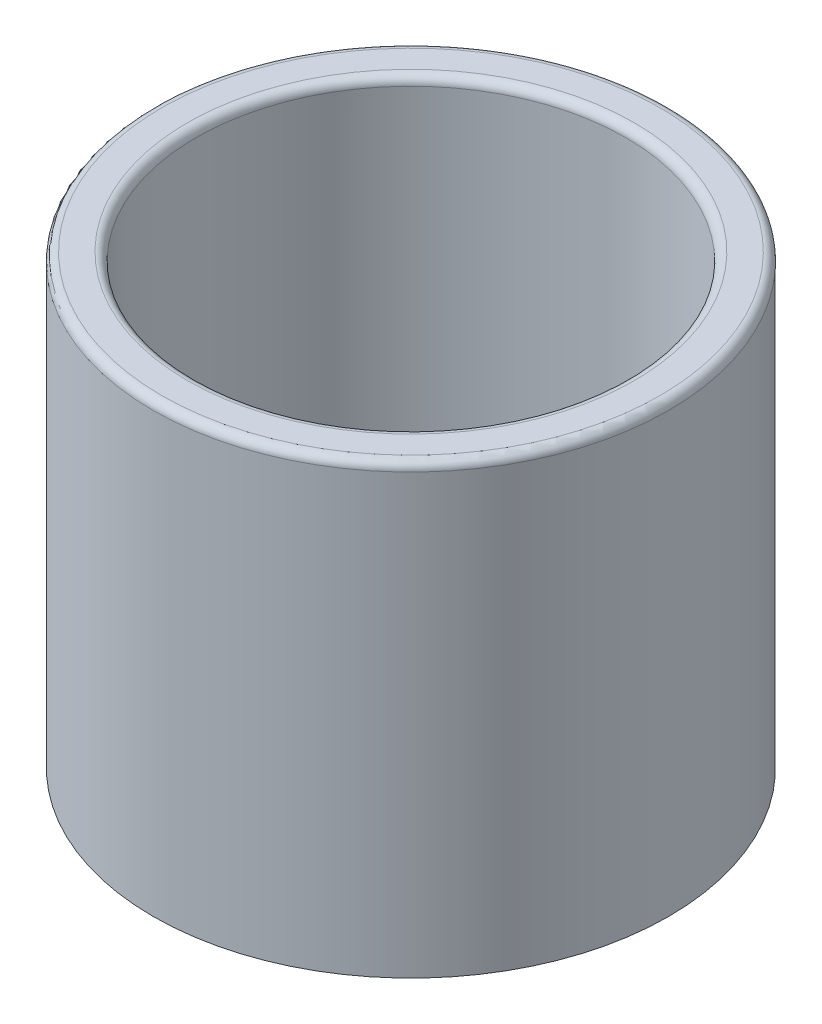
ISO-10303-21;
HEADER;
FILE_DESCRIPTION(('STEP AP214'),'2;1');
FILE_NAME('part.step','',(''),(''),'','','');
FILE_SCHEMA(('AUTOMOTIVE_DESIGN { 1 0 10303 214 1 1 1 1 }'));
ENDSEC;
DATA;
#1=APPLICATION_CONTEXT('core data for automotive mechanical design processes');
#2=APPLICATION_PROTOCOL_DEFINITION('international standard','automotive_design',2000,#1);
#3=PRODUCT_CONTEXT('',#1,'mechanical');
#4=PRODUCT('Part','Part','',(#3));
#5=PRODUCT_RELATED_PRODUCT_CATEGORY('part','',(#4));
#6=PRODUCT_DEFINITION_FORMATION('','',#4);
#7=PRODUCT_DEFINITION_CONTEXT('part definition',#1,'design');
#8=PRODUCT_DEFINITION('design','',#6,#7);
#9=PRODUCT_DEFINITION_SHAPE('','',#8);
#10=(LENGTH_UNIT() NAMED_UNIT(*) SI_UNIT(.MILLI.,.METRE.));
#11=(NAMED_UNIT(*) PLANE_ANGLE_UNIT() SI_UNIT($,.RADIAN.));
#12=(NAMED_UNIT(*) SI_UNIT($,.STERADIAN.) SOLID_ANGLE_UNIT());
#13=UNCERTAINTY_MEASURE_WITH_UNIT(LENGTH_MEASURE(1.E-05),#10,'distance_accuracy_value','');
#14=(GEOMETRIC_REPRESENTATION_CONTEXT(3) GLOBAL_UNCERTAINTY_ASSIGNED_CONTEXT((#13)) GLOBAL_UNIT_ASSIGNED_CONTEXT((#10,
#11,#12)) REPRESENTATION_CONTEXT('',''));
#15=CARTESIAN_POINT('',(0.,0.,0.));
#16=DIRECTION('',(0.,0.,1.));
#17=DIRECTION('',(1.,0.,0.));
#18=AXIS2_PLACEMENT_3D('',#15,#16,#17);
#19=CARTESIAN_POINT('',(0.,50.,0.));
#20=DIRECTION('',(0.,1.,0.));
#21=DIRECTION('',(0.,0.,1.));
#22=AXIS2_PLACEMENT_3D('',#19,#20,#21);
#23=PLANE('',#22);
#24=CARTESIAN_POINT('',(0.,50.,0.));
#25=DIRECTION('',(0.,1.,0.));
#26=DIRECTION('',(0.,0.,1.));
#27=AXIS2_PLACEMENT_3D('',#24,#25,#26);
#28=CIRCLE('',#27,26.);
#29=CARTESIAN_POINT('',(0.,50.,26.));
#30=VERTEX_POINT('',#29);
#31=EDGE_CURVE('E37',#30,#30,#28,.F.);
#32=ORIENTED_EDGE('',*,*,#31,.T.);
#33=EDGE_LOOP('',(#32));
#34=FACE_BOUND('',#33,.T.);
#35=CARTESIAN_POINT('',(0.,50.,0.));
#36=DIRECTION('',(0.,1.,0.));
#37=DIRECTION('',(0.,0.,1.));
#38=AXIS2_PLACEMENT_3D('',#35,#36,#37);
#39=CIRCLE('',#38,29.);
#40=CARTESIAN_POINT('',(0.,50.,29.));
#41=VERTEX_POINT('',#40);
#42=EDGE_CURVE('E41',#41,#41,#39,.T.);
#43=ORIENTED_EDGE('',*,*,#42,.T.);
#44=EDGE_LOOP('',(#43));
#45=FACE_BOUND('',#44,.T.);
#46=ADVANCED_FACE('F30',(#34,#45),#23,.T.);
#47=CARTESIAN_POINT('',(0.,50.,0.));
#48=DIRECTION('',(0.,-1.,0.));
#49=DIRECTION('',(0.,0.,-1.));
#50=AXIS2_PLACEMENT_3D('',#47,#48,#49);
#51=CYLINDRICAL_SURFACE('',#50,30.);
#52=CARTESIAN_POINT('',(0.,49.,0.));
#53=DIRECTION('',(0.,1.,0.));
#54=DIRECTION('',(0.,0.,1.));
#55=AXIS2_PLACEMENT_3D('',#52,#53,#54);
#56=CIRCLE('',#55,30.);
#57=CARTESIAN_POINT('',(0.,49.,30.));
#58=VERTEX_POINT('',#57);
#59=EDGE_CURVE('E10',#58,#58,#56,.F.);
#60=ORIENTED_EDGE('',*,*,#59,.T.);
#61=EDGE_LOOP('',(#60));
#62=FACE_BOUND('',#61,.T.);
#63=CARTESIAN_POINT('',(0.,-2.,0.));
#64=DIRECTION('',(0.,-1.,0.));
#65=DIRECTION('',(0.,0.,-1.));
#66=AXIS2_PLACEMENT_3D('',#63,#64,#65);
#67=CIRCLE('',#66,30.);
#68=CARTESIAN_POINT('',(0.,-2.,-30.));
#69=VERTEX_POINT('',#68);
#70=EDGE_CURVE('E56',#69,#69,#67,.T.);
#71=ORIENTED_EDGE('',*,*,#70,.F.);
#72=EDGE_LOOP('',(#71));
#73=FACE_BOUND('',#72,.T.);
#74=ADVANCED_FACE('F62',(#62,#73),#51,.T.);
#75=CARTESIAN_POINT('',(0.,50.,0.));
#76=DIRECTION('',(0.,-1.,0.));
#77=DIRECTION('',(0.,0.,-1.));
#78=AXIS2_PLACEMENT_3D('',#75,#76,#77);
#79=CYLINDRICAL_SURFACE('',#78,25.);
#80=CARTESIAN_POINT('',(0.,1.,0.));
#81=DIRECTION('',(0.,-1.,0.));
#82=DIRECTION('',(0.,0.,-1.));
#83=AXIS2_PLACEMENT_3D('',#80,#81,#82);
#84=CIRCLE('',#83,25.);
#85=CARTESIAN_POINT('',(0.,1.,-25.));
#86=VERTEX_POINT('',#85);
#87=EDGE_CURVE('E45',#86,#86,#84,.T.);
#88=ORIENTED_EDGE('',*,*,#87,.T.);
#89=EDGE_LOOP('',(#88));
#90=FACE_BOUND('',#89,.T.);
#91=CARTESIAN_POINT('',(0.,49.,0.));
#92=DIRECTION('',(0.,1.,0.));
#93=DIRECTION('',(0.,0.,1.));
#94=AXIS2_PLACEMENT_3D('',#91,#92,#93);
#95=CIRCLE('',#94,25.);
#96=CARTESIAN_POINT('',(0.,49.,25.));
#97=VERTEX_POINT('',#96);
#98=EDGE_CURVE('E50',#97,#97,#95,.T.);
#99=ORIENTED_EDGE('',*,*,#98,.T.);
#100=EDGE_LOOP('',(#99));
#101=FACE_BOUND('',#100,.T.);
#102=ADVANCED_FACE('F64',(#90,#101),#79,.F.);
#103=CARTESIAN_POINT('',(0.,0.,0.));
#104=DIRECTION('',(0.,-1.,0.));
#105=DIRECTION('',(0.,0.,-1.));
#106=AXIS2_PLACEMENT_3D('',#103,#104,#105);
#107=PLANE('',#106);
#108=CARTESIAN_POINT('',(0.,0.,0.));
#109=DIRECTION('',(0.,-1.,0.));
#110=DIRECTION('',(0.,0.,-1.));
#111=AXIS2_PLACEMENT_3D('',#108,#109,#110);
#112=CIRCLE('',#111,24.);
#113=CARTESIAN_POINT('',(0.,0.,-24.));
#114=VERTEX_POINT('',#113);
#115=EDGE_CURVE('E53',#114,#114,#112,.F.);
#116=ORIENTED_EDGE('',*,*,#115,.T.);
#117=EDGE_LOOP('',(#116));
#118=FACE_BOUND('',#117,.T.);
#119=ADVANCED_FACE('F70',(#118),#107,.F.);
#120=CARTESIAN_POINT('',(0.,-2.,0.));
#121=DIRECTION('',(0.,-1.,0.));
#122=DIRECTION('',(0.,0.,-1.));
#123=AXIS2_PLACEMENT_3D('',#120,#121,#122);
#124=PLANE('',#123);
#125=ORIENTED_EDGE('',*,*,#70,.T.);
#126=EDGE_LOOP('',(#125));
#127=FACE_BOUND('',#126,.T.);
#128=ADVANCED_FACE('F60',(#127),#124,.T.);
#129=CARTESIAN_POINT('',(0.,1.,0.));
#130=DIRECTION('',(0.,-1.,0.));
#131=DIRECTION('',(0.,0.,-1.));
#132=AXIS2_PLACEMENT_3D('',#129,#130,#131);
#133=TOROIDAL_SURFACE('',#132,24.,1.);
#134=ORIENTED_EDGE('',*,*,#87,.F.);
#135=EDGE_LOOP('',(#134));
#136=FACE_BOUND('',#135,.T.);
#137=ORIENTED_EDGE('',*,*,#115,.F.);
#138=EDGE_LOOP('',(#137));
#139=FACE_BOUND('',#138,.T.);
#140=ADVANCED_FACE('F75',(#136,#139),#133,.F.);
#141=CARTESIAN_POINT('',(0.,49.,0.));
#142=DIRECTION('',(0.,1.,0.));
#143=DIRECTION('',(0.,0.,1.));
#144=AXIS2_PLACEMENT_3D('',#141,#142,#143);
#145=TOROIDAL_SURFACE('',#144,26.,1.);
#146=ORIENTED_EDGE('',*,*,#31,.F.);
#147=EDGE_LOOP('',(#146));
#148=FACE_BOUND('',#147,.T.);
#149=ORIENTED_EDGE('',*,*,#98,.F.);
#150=EDGE_LOOP('',(#149));
#151=FACE_BOUND('',#150,.T.);
#152=ADVANCED_FACE('F77',(#148,#151),#145,.T.);
#153=CARTESIAN_POINT('',(0.,49.,0.));
#154=DIRECTION('',(0.,1.,0.));
#155=DIRECTION('',(0.,0.,1.));
#156=AXIS2_PLACEMENT_3D('',#153,#154,#155);
#157=TOROIDAL_SURFACE('',#156,29.,1.);
#158=ORIENTED_EDGE('',*,*,#59,.F.);
#159=EDGE_LOOP('',(#158));
#160=FACE_BOUND('',#159,.T.);
#161=ORIENTED_EDGE('',*,*,#42,.F.);
#162=EDGE_LOOP('',(#161));
#163=FACE_BOUND('',#162,.T.);
#164=ADVANCED_FACE('F32',(#160,#163),#157,.T.);
#165=CLOSED_SHELL('',(#46,#74,#102,#119,#128,#140,#152,#164));
#166=MANIFOLD_SOLID_BREP('B2',#165);
#167=ADVANCED_BREP_SHAPE_REPRESENTATION('',(#18,#166),#14);
#168=SHAPE_DEFINITION_REPRESENTATION(#9,#167);
ENDSEC;
END-ISO-10303-21;
